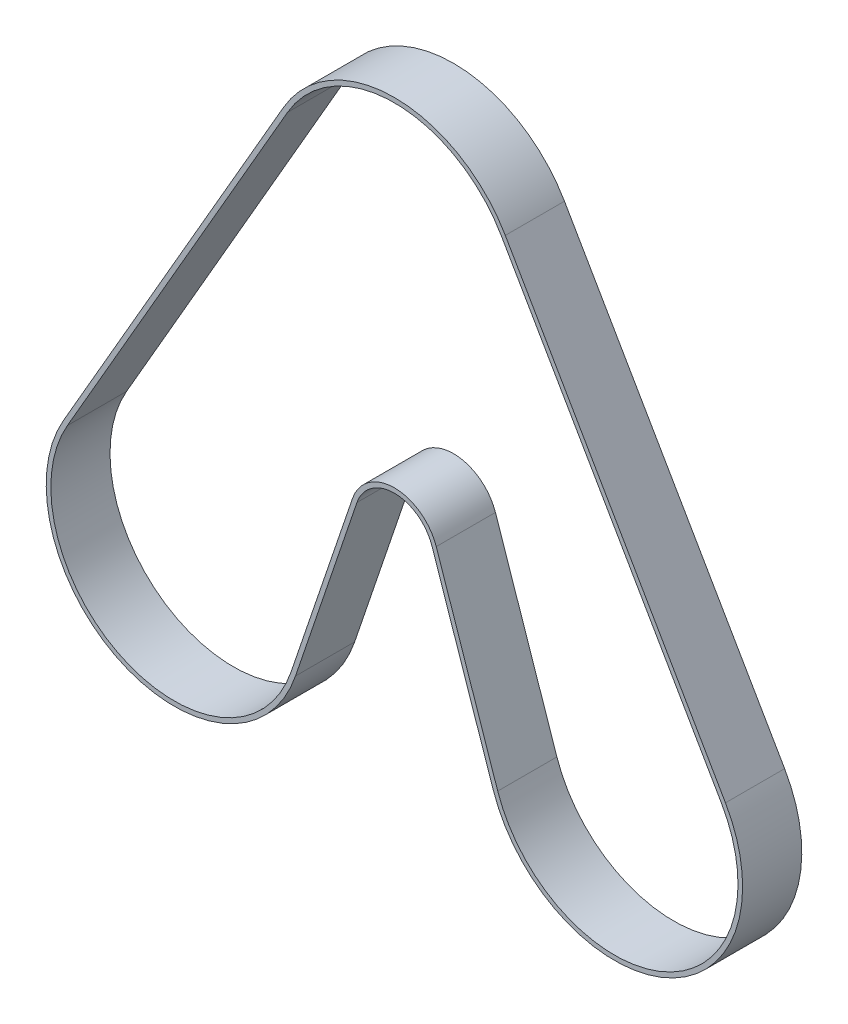
ISO-10303-21;
HEADER;
FILE_DESCRIPTION(('STEP AP214'),'2;1');
FILE_NAME('part.step','',(''),(''),'','','');
FILE_SCHEMA(('AUTOMOTIVE_DESIGN { 1 0 10303 214 1 1 1 1 }'));
ENDSEC;
DATA;
#1=APPLICATION_CONTEXT('core data for automotive mechanical design processes');
#2=APPLICATION_PROTOCOL_DEFINITION('international standard','automotive_design',2000,#1);
#3=PRODUCT_CONTEXT('',#1,'mechanical');
#4=PRODUCT('Part','Part','',(#3));
#5=PRODUCT_RELATED_PRODUCT_CATEGORY('part','',(#4));
#6=PRODUCT_DEFINITION_FORMATION('','',#4);
#7=PRODUCT_DEFINITION_CONTEXT('part definition',#1,'design');
#8=PRODUCT_DEFINITION('design','',#6,#7);
#9=PRODUCT_DEFINITION_SHAPE('','',#8);
#10=(LENGTH_UNIT() NAMED_UNIT(*) SI_UNIT(.MILLI.,.METRE.));
#11=(NAMED_UNIT(*) PLANE_ANGLE_UNIT() SI_UNIT($,.RADIAN.));
#12=(NAMED_UNIT(*) SI_UNIT($,.STERADIAN.) SOLID_ANGLE_UNIT());
#13=UNCERTAINTY_MEASURE_WITH_UNIT(LENGTH_MEASURE(1.E-05),#10,'distance_accuracy_value','');
#14=(GEOMETRIC_REPRESENTATION_CONTEXT(3) GLOBAL_UNCERTAINTY_ASSIGNED_CONTEXT((#13)) GLOBAL_UNIT_ASSIGNED_CONTEXT((#10,
#11,#12)) REPRESENTATION_CONTEXT('',''));
#15=CARTESIAN_POINT('',(0.,0.,0.));
#16=DIRECTION('',(0.,0.,1.));
#17=DIRECTION('',(1.,0.,0.));
#18=AXIS2_PLACEMENT_3D('',#15,#16,#17);
#19=CARTESIAN_POINT('',(0.,27.5,3.2));
#20=DIRECTION('',(0.,0.,-1.));
#21=DIRECTION('',(-1.,0.,0.));
#22=AXIS2_PLACEMENT_3D('',#19,#20,#21);
#23=PLANE('',#22);
#24=CARTESIAN_POINT('',(0.,27.5,3.2));
#25=DIRECTION('',(0.,0.,-1.));
#26=DIRECTION('',(-1.,0.,0.));
#27=AXIS2_PLACEMENT_3D('',#24,#25,#26);
#28=CIRCLE('',#27,13.85);
#29=CARTESIAN_POINT('',(11.9944518424145,34.425,3.2));
#30=VERTEX_POINT('',#29);
#31=CARTESIAN_POINT('',(-11.9944518424145,34.425,3.2));
#32=VERTEX_POINT('',#31);
#33=EDGE_CURVE('E267',#30,#32,#28,.F.);
#34=ORIENTED_EDGE('',*,*,#33,.T.);
#35=DIRECTION('',(-0.499999999999998,-0.86602540378444,0.));
#36=VECTOR('',#35,1.);
#37=CARTESIAN_POINT('',(-11.9944518424145,34.425,3.2));
#38=LINE('',#37,#36);
#39=CARTESIAN_POINT('',(-35.8101504464865,-6.82500000000016,3.2));
#40=VERTEX_POINT('',#39);
#41=EDGE_CURVE('E270',#32,#40,#38,.T.);
#42=ORIENTED_EDGE('',*,*,#41,.T.);
#43=CARTESIAN_POINT('',(-23.815698604072,-13.7500000000001,3.2));
#44=DIRECTION('',(0.,0.,-1.));
#45=DIRECTION('',(-1.,0.,0.));
#46=AXIS2_PLACEMENT_3D('',#43,#44,#45);
#47=CIRCLE('',#46,13.85);
#48=CARTESIAN_POINT('',(-10.7011491356005,-18.2032114523135,3.2));
#49=VERTEX_POINT('',#48);
#50=EDGE_CURVE('E273',#40,#49,#47,.F.);
#51=ORIENTED_EDGE('',*,*,#50,.T.);
#52=DIRECTION('',(0.321531512802408,0.946898878589998,0.));
#53=VECTOR('',#52,1.);
#54=CARTESIAN_POINT('',(4.31986309449331,26.0331357473567,3.2));
#55=LINE('',#54,#53);
#56=CARTESIAN_POINT('',(-4.05272720036519,1.3761548747943,3.2));
#57=VERTEX_POINT('',#56);
#58=EDGE_CURVE('E275',#49,#57,#55,.T.);
#59=ORIENTED_EDGE('',*,*,#58,.T.);
#60=CARTESIAN_POINT('',(0.,0.,3.2));
#61=DIRECTION('',(0.,0.,-1.));
#62=DIRECTION('',(-1.,0.,0.));
#63=AXIS2_PLACEMENT_3D('',#60,#61,#62);
#64=CIRCLE('',#63,4.28);
#65=CARTESIAN_POINT('',(4.05272720036519,1.37615487479431,3.2));
#66=VERTEX_POINT('',#65);
#67=EDGE_CURVE('E277',#57,#66,#64,.T.);
#68=ORIENTED_EDGE('',*,*,#67,.T.);
#69=DIRECTION('',(0.321531512802408,-0.946898878589998,0.));
#70=VECTOR('',#69,1.);
#71=CARTESIAN_POINT('',(-4.31986309449332,26.0331357473567,3.2));
#72=LINE('',#71,#70);
#73=CARTESIAN_POINT('',(10.7011491356005,-18.2032114523135,3.2));
#74=VERTEX_POINT('',#73);
#75=EDGE_CURVE('E279',#66,#74,#72,.T.);
#76=ORIENTED_EDGE('',*,*,#75,.T.);
#77=CARTESIAN_POINT('',(23.815698604072,-13.7500000000001,3.2));
#78=DIRECTION('',(0.,0.,-1.));
#79=DIRECTION('',(-1.,0.,0.));
#80=AXIS2_PLACEMENT_3D('',#77,#78,#79);
#81=CIRCLE('',#80,13.85);
#82=CARTESIAN_POINT('',(35.8101504464865,-6.82500000000014,3.2));
#83=VERTEX_POINT('',#82);
#84=EDGE_CURVE('E281',#74,#83,#81,.F.);
#85=ORIENTED_EDGE('',*,*,#84,.T.);
#86=DIRECTION('',(-0.499999999999998,0.86602540378444,0.));
#87=VECTOR('',#86,1.);
#88=CARTESIAN_POINT('',(11.9944518424145,34.425,3.2));
#89=LINE('',#88,#87);
#90=EDGE_CURVE('E283',#83,#30,#89,.T.);
#91=ORIENTED_EDGE('',*,*,#90,.T.);
#92=EDGE_LOOP('',(#34,#42,#51,#59,#68,#76,#85,#91));
#93=FACE_BOUND('',#92,.T.);
#94=CARTESIAN_POINT('',(0.,27.5,3.2));
#95=DIRECTION('',(0.,0.,-1.));
#96=DIRECTION('',(-1.,0.,0.));
#97=AXIS2_PLACEMENT_3D('',#94,#95,#96);
#98=CIRCLE('',#97,13.35);
#99=CARTESIAN_POINT('',(11.5614391405223,34.175,3.2));
#100=VERTEX_POINT('',#99);
#101=CARTESIAN_POINT('',(-11.5614391405223,34.175,3.2));
#102=VERTEX_POINT('',#101);
#103=EDGE_CURVE('E202',#100,#102,#98,.F.);
#104=ORIENTED_EDGE('',*,*,#103,.F.);
#105=DIRECTION('',(-0.499999999999998,0.86602540378444,0.));
#106=VECTOR('',#105,1.);
#107=CARTESIAN_POINT('',(11.5614391405223,34.175,3.2));
#108=LINE('',#107,#106);
#109=CARTESIAN_POINT('',(35.3771377445943,-7.07500000000014,3.2));
#110=VERTEX_POINT('',#109);
#111=EDGE_CURVE('E235',#110,#100,#108,.T.);
#112=ORIENTED_EDGE('',*,*,#111,.F.);
#113=CARTESIAN_POINT('',(23.815698604072,-13.7500000000001,3.2));
#114=DIRECTION('',(0.,0.,-1.));
#115=DIRECTION('',(-1.,0.,0.));
#116=AXIS2_PLACEMENT_3D('',#113,#114,#115);
#117=CIRCLE('',#116,13.35);
#118=CARTESIAN_POINT('',(11.1745985748955,-18.0424456959123,3.2));
#119=VERTEX_POINT('',#118);
#120=EDGE_CURVE('E233',#119,#110,#117,.F.);
#121=ORIENTED_EDGE('',*,*,#120,.F.);
#122=DIRECTION('',(0.321531512802408,-0.946898878589998,0.));
#123=VECTOR('',#122,1.);
#124=CARTESIAN_POINT('',(-3.84641365519831,26.1939015037579,3.2));
#125=LINE('',#124,#123);
#126=CARTESIAN_POINT('',(4.52617663966019,1.53692063119551,3.2));
#127=VERTEX_POINT('',#126);
#128=EDGE_CURVE('E231',#127,#119,#125,.T.);
#129=ORIENTED_EDGE('',*,*,#128,.F.);
#130=CARTESIAN_POINT('',(0.,0.,3.2));
#131=DIRECTION('',(0.,0.,-1.));
#132=DIRECTION('',(-1.,0.,0.));
#133=AXIS2_PLACEMENT_3D('',#130,#131,#132);
#134=CIRCLE('',#133,4.78);
#135=CARTESIAN_POINT('',(-4.52617663966019,1.53692063119551,3.2));
#136=VERTEX_POINT('',#135);
#137=EDGE_CURVE('E229',#136,#127,#134,.T.);
#138=ORIENTED_EDGE('',*,*,#137,.F.);
#139=DIRECTION('',(0.321531512802408,0.946898878589998,0.));
#140=VECTOR('',#139,1.);
#141=CARTESIAN_POINT('',(3.84641365519831,26.1939015037579,3.2));
#142=LINE('',#141,#140);
#143=CARTESIAN_POINT('',(-11.1745985748955,-18.0424456959123,3.2));
#144=VERTEX_POINT('',#143);
#145=EDGE_CURVE('E225',#144,#136,#142,.T.);
#146=ORIENTED_EDGE('',*,*,#145,.F.);
#147=CARTESIAN_POINT('',(-23.815698604072,-13.7500000000001,3.2));
#148=DIRECTION('',(0.,0.,-1.));
#149=DIRECTION('',(-1.,0.,0.));
#150=AXIS2_PLACEMENT_3D('',#147,#148,#149);
#151=CIRCLE('',#150,13.35);
#152=CARTESIAN_POINT('',(-35.3771377445943,-7.07500000000016,3.2));
#153=VERTEX_POINT('',#152);
#154=EDGE_CURVE('E223',#153,#144,#151,.F.);
#155=ORIENTED_EDGE('',*,*,#154,.F.);
#156=DIRECTION('',(-0.499999999999998,-0.86602540378444,0.));
#157=VECTOR('',#156,1.);
#158=CARTESIAN_POINT('',(-11.5614391405223,34.175,3.2));
#159=LINE('',#158,#157);
#160=EDGE_CURVE('E210',#102,#153,#159,.T.);
#161=ORIENTED_EDGE('',*,*,#160,.F.);
#162=EDGE_LOOP('',(#104,#112,#121,#129,#138,#146,#155,#161));
#163=FACE_BOUND('',#162,.T.);
#164=ADVANCED_FACE('F89',(#93,#163),#23,.F.);
#165=CARTESIAN_POINT('',(0.,27.5,-3.2));
#166=DIRECTION('',(0.,0.,-1.));
#167=DIRECTION('',(-1.,0.,0.));
#168=AXIS2_PLACEMENT_3D('',#165,#166,#167);
#169=PLANE('',#168);
#170=CARTESIAN_POINT('',(0.,27.5,-3.2));
#171=DIRECTION('',(0.,0.,-1.));
#172=DIRECTION('',(-1.,0.,0.));
#173=AXIS2_PLACEMENT_3D('',#170,#171,#172);
#174=CIRCLE('',#173,13.85);
#175=CARTESIAN_POINT('',(11.9944518424145,34.425,-3.2));
#176=VERTEX_POINT('',#175);
#177=CARTESIAN_POINT('',(-11.9944518424145,34.425,-3.2));
#178=VERTEX_POINT('',#177);
#179=EDGE_CURVE('E218',#176,#178,#174,.F.);
#180=ORIENTED_EDGE('',*,*,#179,.F.);
#181=DIRECTION('',(-0.499999999999998,0.86602540378444,0.));
#182=VECTOR('',#181,1.);
#183=CARTESIAN_POINT('',(11.9944518424145,34.425,-3.2));
#184=LINE('',#183,#182);
#185=CARTESIAN_POINT('',(35.8101504464865,-6.82500000000014,-3.2));
#186=VERTEX_POINT('',#185);
#187=EDGE_CURVE('E271',#186,#176,#184,.T.);
#188=ORIENTED_EDGE('',*,*,#187,.F.);
#189=CARTESIAN_POINT('',(23.815698604072,-13.7500000000001,-3.2));
#190=DIRECTION('',(0.,0.,-1.));
#191=DIRECTION('',(-1.,0.,0.));
#192=AXIS2_PLACEMENT_3D('',#189,#190,#191);
#193=CIRCLE('',#192,13.85);
#194=CARTESIAN_POINT('',(10.7011491356005,-18.2032114523135,-3.2));
#195=VERTEX_POINT('',#194);
#196=EDGE_CURVE('E298',#195,#186,#193,.F.);
#197=ORIENTED_EDGE('',*,*,#196,.F.);
#198=DIRECTION('',(0.321531512802408,-0.946898878589998,0.));
#199=VECTOR('',#198,1.);
#200=CARTESIAN_POINT('',(-4.31986309449332,26.0331357473567,-3.2));
#201=LINE('',#200,#199);
#202=CARTESIAN_POINT('',(4.05272720036519,1.37615487479431,-3.2));
#203=VERTEX_POINT('',#202);
#204=EDGE_CURVE('E296',#203,#195,#201,.T.);
#205=ORIENTED_EDGE('',*,*,#204,.F.);
#206=CARTESIAN_POINT('',(0.,0.,-3.2));
#207=DIRECTION('',(0.,0.,-1.));
#208=DIRECTION('',(-1.,0.,0.));
#209=AXIS2_PLACEMENT_3D('',#206,#207,#208);
#210=CIRCLE('',#209,4.28);
#211=CARTESIAN_POINT('',(-4.05272720036519,1.3761548747943,-3.2));
#212=VERTEX_POINT('',#211);
#213=EDGE_CURVE('E294',#212,#203,#210,.T.);
#214=ORIENTED_EDGE('',*,*,#213,.F.);
#215=DIRECTION('',(0.321531512802408,0.946898878589998,0.));
#216=VECTOR('',#215,1.);
#217=CARTESIAN_POINT('',(4.31986309449331,26.0331357473567,-3.2));
#218=LINE('',#217,#216);
#219=CARTESIAN_POINT('',(-10.7011491356005,-18.2032114523135,-3.2));
#220=VERTEX_POINT('',#219);
#221=EDGE_CURVE('E292',#220,#212,#218,.T.);
#222=ORIENTED_EDGE('',*,*,#221,.F.);
#223=CARTESIAN_POINT('',(-23.815698604072,-13.7500000000001,-3.2));
#224=DIRECTION('',(0.,0.,-1.));
#225=DIRECTION('',(-1.,0.,0.));
#226=AXIS2_PLACEMENT_3D('',#223,#224,#225);
#227=CIRCLE('',#226,13.85);
#228=CARTESIAN_POINT('',(-35.8101504464865,-6.82500000000016,-3.2));
#229=VERTEX_POINT('',#228);
#230=EDGE_CURVE('E290',#229,#220,#227,.F.);
#231=ORIENTED_EDGE('',*,*,#230,.F.);
#232=DIRECTION('',(-0.499999999999998,-0.86602540378444,0.));
#233=VECTOR('',#232,1.);
#234=CARTESIAN_POINT('',(-11.9944518424145,34.425,-3.2));
#235=LINE('',#234,#233);
#236=EDGE_CURVE('E288',#178,#229,#235,.T.);
#237=ORIENTED_EDGE('',*,*,#236,.F.);
#238=EDGE_LOOP('',(#180,#188,#197,#205,#214,#222,#231,#237));
#239=FACE_BOUND('',#238,.T.);
#240=DIRECTION('',(-0.499999999999998,0.86602540378444,0.));
#241=VECTOR('',#240,1.);
#242=CARTESIAN_POINT('',(11.5614391405223,34.175,-3.2));
#243=LINE('',#242,#241);
#244=CARTESIAN_POINT('',(35.3771377445943,-7.07500000000014,-3.2));
#245=VERTEX_POINT('',#244);
#246=CARTESIAN_POINT('',(11.5614391405223,34.175,-3.2));
#247=VERTEX_POINT('',#246);
#248=EDGE_CURVE('E211',#245,#247,#243,.T.);
#249=ORIENTED_EDGE('',*,*,#248,.T.);
#250=CARTESIAN_POINT('',(0.,27.5,-3.2));
#251=DIRECTION('',(0.,0.,-1.));
#252=DIRECTION('',(-1.,0.,0.));
#253=AXIS2_PLACEMENT_3D('',#250,#251,#252);
#254=CIRCLE('',#253,13.35);
#255=CARTESIAN_POINT('',(-11.5614391405223,34.175,-3.2));
#256=VERTEX_POINT('',#255);
#257=EDGE_CURVE('E112',#247,#256,#254,.F.);
#258=ORIENTED_EDGE('',*,*,#257,.T.);
#259=DIRECTION('',(-0.499999999999998,-0.86602540378444,0.));
#260=VECTOR('',#259,1.);
#261=CARTESIAN_POINT('',(-11.5614391405223,34.175,-3.2));
#262=LINE('',#261,#260);
#263=CARTESIAN_POINT('',(-35.3771377445943,-7.07500000000016,-3.2));
#264=VERTEX_POINT('',#263);
#265=EDGE_CURVE('E217',#256,#264,#262,.T.);
#266=ORIENTED_EDGE('',*,*,#265,.T.);
#267=CARTESIAN_POINT('',(-23.815698604072,-13.7500000000001,-3.2));
#268=DIRECTION('',(0.,0.,-1.));
#269=DIRECTION('',(-1.,0.,0.));
#270=AXIS2_PLACEMENT_3D('',#267,#268,#269);
#271=CIRCLE('',#270,13.35);
#272=CARTESIAN_POINT('',(-11.1745985748955,-18.0424456959123,-3.2));
#273=VERTEX_POINT('',#272);
#274=EDGE_CURVE('E239',#264,#273,#271,.F.);
#275=ORIENTED_EDGE('',*,*,#274,.T.);
#276=DIRECTION('',(0.321531512802408,0.946898878589998,0.));
#277=VECTOR('',#276,1.);
#278=CARTESIAN_POINT('',(3.84641365519831,26.1939015037579,-3.2));
#279=LINE('',#278,#277);
#280=CARTESIAN_POINT('',(-4.52617663966019,1.53692063119551,-3.2));
#281=VERTEX_POINT('',#280);
#282=EDGE_CURVE('E242',#273,#281,#279,.T.);
#283=ORIENTED_EDGE('',*,*,#282,.T.);
#284=CARTESIAN_POINT('',(0.,0.,-3.2));
#285=DIRECTION('',(0.,0.,-1.));
#286=DIRECTION('',(-1.,0.,0.));
#287=AXIS2_PLACEMENT_3D('',#284,#285,#286);
#288=CIRCLE('',#287,4.78);
#289=CARTESIAN_POINT('',(4.52617663966019,1.53692063119551,-3.2));
#290=VERTEX_POINT('',#289);
#291=EDGE_CURVE('E245',#281,#290,#288,.T.);
#292=ORIENTED_EDGE('',*,*,#291,.T.);
#293=DIRECTION('',(0.321531512802408,-0.946898878589998,0.));
#294=VECTOR('',#293,1.);
#295=CARTESIAN_POINT('',(-3.84641365519831,26.1939015037579,-3.2));
#296=LINE('',#295,#294);
#297=CARTESIAN_POINT('',(11.1745985748955,-18.0424456959123,-3.2));
#298=VERTEX_POINT('',#297);
#299=EDGE_CURVE('E248',#290,#298,#296,.T.);
#300=ORIENTED_EDGE('',*,*,#299,.T.);
#301=CARTESIAN_POINT('',(23.815698604072,-13.7500000000001,-3.2));
#302=DIRECTION('',(0.,0.,-1.));
#303=DIRECTION('',(-1.,0.,0.));
#304=AXIS2_PLACEMENT_3D('',#301,#302,#303);
#305=CIRCLE('',#304,13.35);
#306=EDGE_CURVE('E251',#298,#245,#305,.F.);
#307=ORIENTED_EDGE('',*,*,#306,.T.);
#308=EDGE_LOOP('',(#249,#258,#266,#275,#283,#292,#300,#307));
#309=FACE_BOUND('',#308,.T.);
#310=ADVANCED_FACE('F328',(#239,#309),#169,.T.);
#311=CARTESIAN_POINT('',(0.,27.5,3.2));
#312=DIRECTION('',(0.,0.,-1.));
#313=DIRECTION('',(-1.,0.,0.));
#314=AXIS2_PLACEMENT_3D('',#311,#312,#313);
#315=CYLINDRICAL_SURFACE('',#314,13.85);
#316=ORIENTED_EDGE('',*,*,#179,.T.);
#317=DIRECTION('',(0.,0.,-1.));
#318=VECTOR('',#317,1.);
#319=CARTESIAN_POINT('',(-11.9944518424145,34.425,3.2));
#320=LINE('',#319,#318);
#321=EDGE_CURVE('E12',#32,#178,#320,.T.);
#322=ORIENTED_EDGE('',*,*,#321,.F.);
#323=ORIENTED_EDGE('',*,*,#33,.F.);
#324=DIRECTION('',(0.,0.,-1.));
#325=VECTOR('',#324,1.);
#326=CARTESIAN_POINT('',(11.9944518424145,34.425,3.2));
#327=LINE('',#326,#325);
#328=EDGE_CURVE('E285',#30,#176,#327,.T.);
#329=ORIENTED_EDGE('',*,*,#328,.T.);
#330=EDGE_LOOP('',(#316,#322,#323,#329));
#331=FACE_BOUND('',#330,.T.);
#332=ADVANCED_FACE('F91',(#331),#315,.T.);
#333=CARTESIAN_POINT('',(-11.9944518424145,34.425,3.2));
#334=DIRECTION('',(0.86602540378444,-0.499999999999998,0.));
#335=DIRECTION('',(0.499999999999998,0.86602540378444,0.));
#336=AXIS2_PLACEMENT_3D('',#333,#334,#335);
#337=PLANE('',#336);
#338=ORIENTED_EDGE('',*,*,#236,.T.);
#339=DIRECTION('',(0.,0.,-1.));
#340=VECTOR('',#339,1.);
#341=CARTESIAN_POINT('',(-35.8101504464865,-6.82500000000016,3.2));
#342=LINE('',#341,#340);
#343=EDGE_CURVE('E97',#40,#229,#342,.T.);
#344=ORIENTED_EDGE('',*,*,#343,.F.);
#345=ORIENTED_EDGE('',*,*,#41,.F.);
#346=ORIENTED_EDGE('',*,*,#321,.T.);
#347=EDGE_LOOP('',(#338,#344,#345,#346));
#348=FACE_BOUND('',#347,.T.);
#349=ADVANCED_FACE('F345',(#348),#337,.F.);
#350=CARTESIAN_POINT('',(-23.815698604072,-13.7500000000001,3.2));
#351=DIRECTION('',(0.,0.,-1.));
#352=DIRECTION('',(-1.,0.,0.));
#353=AXIS2_PLACEMENT_3D('',#350,#351,#352);
#354=CYLINDRICAL_SURFACE('',#353,13.85);
#355=ORIENTED_EDGE('',*,*,#230,.T.);
#356=DIRECTION('',(0.,0.,-1.));
#357=VECTOR('',#356,1.);
#358=CARTESIAN_POINT('',(-10.7011491356005,-18.2032114523135,3.2));
#359=LINE('',#358,#357);
#360=EDGE_CURVE('E315',#49,#220,#359,.T.);
#361=ORIENTED_EDGE('',*,*,#360,.F.);
#362=ORIENTED_EDGE('',*,*,#50,.F.);
#363=ORIENTED_EDGE('',*,*,#343,.T.);
#364=EDGE_LOOP('',(#355,#361,#362,#363));
#365=FACE_BOUND('',#364,.T.);
#366=ADVANCED_FACE('F322',(#365),#354,.T.);
#367=CARTESIAN_POINT('',(4.31986309449331,26.0331357473567,3.2));
#368=DIRECTION('',(-0.946898878589998,0.321531512802408,0.));
#369=DIRECTION('',(-0.321531512802408,-0.946898878589998,0.));
#370=AXIS2_PLACEMENT_3D('',#367,#368,#369);
#371=PLANE('',#370);
#372=ORIENTED_EDGE('',*,*,#221,.T.);
#373=DIRECTION('',(0.,0.,-1.));
#374=VECTOR('',#373,1.);
#375=CARTESIAN_POINT('',(-4.05272720036519,1.3761548747943,3.2));
#376=LINE('',#375,#374);
#377=EDGE_CURVE('E312',#57,#212,#376,.T.);
#378=ORIENTED_EDGE('',*,*,#377,.F.);
#379=ORIENTED_EDGE('',*,*,#58,.F.);
#380=ORIENTED_EDGE('',*,*,#360,.T.);
#381=EDGE_LOOP('',(#372,#378,#379,#380));
#382=FACE_BOUND('',#381,.T.);
#383=ADVANCED_FACE('F334',(#382),#371,.F.);
#384=CARTESIAN_POINT('',(0.,0.,3.2));
#385=DIRECTION('',(0.,0.,-1.));
#386=DIRECTION('',(-1.,0.,0.));
#387=AXIS2_PLACEMENT_3D('',#384,#385,#386);
#388=CYLINDRICAL_SURFACE('',#387,4.28);
#389=ORIENTED_EDGE('',*,*,#213,.T.);
#390=DIRECTION('',(0.,0.,-1.));
#391=VECTOR('',#390,1.);
#392=CARTESIAN_POINT('',(4.05272720036519,1.37615487479431,3.2));
#393=LINE('',#392,#391);
#394=EDGE_CURVE('E309',#66,#203,#393,.T.);
#395=ORIENTED_EDGE('',*,*,#394,.F.);
#396=ORIENTED_EDGE('',*,*,#67,.F.);
#397=ORIENTED_EDGE('',*,*,#377,.T.);
#398=EDGE_LOOP('',(#389,#395,#396,#397));
#399=FACE_BOUND('',#398,.T.);
#400=ADVANCED_FACE('F338',(#399),#388,.F.);
#401=CARTESIAN_POINT('',(-4.31986309449332,26.0331357473567,3.2));
#402=DIRECTION('',(0.946898878589998,0.321531512802408,0.));
#403=DIRECTION('',(-0.321531512802408,0.946898878589998,0.));
#404=AXIS2_PLACEMENT_3D('',#401,#402,#403);
#405=PLANE('',#404);
#406=ORIENTED_EDGE('',*,*,#204,.T.);
#407=DIRECTION('',(0.,0.,-1.));
#408=VECTOR('',#407,1.);
#409=CARTESIAN_POINT('',(10.7011491356005,-18.2032114523135,3.2));
#410=LINE('',#409,#408);
#411=EDGE_CURVE('E306',#74,#195,#410,.T.);
#412=ORIENTED_EDGE('',*,*,#411,.F.);
#413=ORIENTED_EDGE('',*,*,#75,.F.);
#414=ORIENTED_EDGE('',*,*,#394,.T.);
#415=EDGE_LOOP('',(#406,#412,#413,#414));
#416=FACE_BOUND('',#415,.T.);
#417=ADVANCED_FACE('F358',(#416),#405,.F.);
#418=CARTESIAN_POINT('',(23.815698604072,-13.7500000000001,3.2));
#419=DIRECTION('',(0.,0.,-1.));
#420=DIRECTION('',(-1.,0.,0.));
#421=AXIS2_PLACEMENT_3D('',#418,#419,#420);
#422=CYLINDRICAL_SURFACE('',#421,13.85);
#423=ORIENTED_EDGE('',*,*,#196,.T.);
#424=DIRECTION('',(0.,0.,-1.));
#425=VECTOR('',#424,1.);
#426=CARTESIAN_POINT('',(35.8101504464865,-6.82500000000014,3.2));
#427=LINE('',#426,#425);
#428=EDGE_CURVE('E303',#83,#186,#427,.T.);
#429=ORIENTED_EDGE('',*,*,#428,.F.);
#430=ORIENTED_EDGE('',*,*,#84,.F.);
#431=ORIENTED_EDGE('',*,*,#411,.T.);
#432=EDGE_LOOP('',(#423,#429,#430,#431));
#433=FACE_BOUND('',#432,.T.);
#434=ADVANCED_FACE('F356',(#433),#422,.T.);
#435=CARTESIAN_POINT('',(11.9944518424145,34.425,3.2));
#436=DIRECTION('',(-0.86602540378444,-0.499999999999998,0.));
#437=DIRECTION('',(0.499999999999998,-0.86602540378444,0.));
#438=AXIS2_PLACEMENT_3D('',#435,#436,#437);
#439=PLANE('',#438);
#440=ORIENTED_EDGE('',*,*,#187,.T.);
#441=ORIENTED_EDGE('',*,*,#328,.F.);
#442=ORIENTED_EDGE('',*,*,#90,.F.);
#443=ORIENTED_EDGE('',*,*,#428,.T.);
#444=EDGE_LOOP('',(#440,#441,#442,#443));
#445=FACE_BOUND('',#444,.T.);
#446=ADVANCED_FACE('F351',(#445),#439,.F.);
#447=CARTESIAN_POINT('',(0.,27.5,3.2));
#448=DIRECTION('',(0.,0.,-1.));
#449=DIRECTION('',(-1.,0.,0.));
#450=AXIS2_PLACEMENT_3D('',#447,#448,#449);
#451=CYLINDRICAL_SURFACE('',#450,13.35);
#452=ORIENTED_EDGE('',*,*,#257,.F.);
#453=DIRECTION('',(0.,0.,-1.));
#454=VECTOR('',#453,1.);
#455=CARTESIAN_POINT('',(11.5614391405223,34.175,3.2));
#456=LINE('',#455,#454);
#457=EDGE_CURVE('E206',#100,#247,#456,.T.);
#458=ORIENTED_EDGE('',*,*,#457,.F.);
#459=ORIENTED_EDGE('',*,*,#103,.T.);
#460=DIRECTION('',(0.,0.,-1.));
#461=VECTOR('',#460,1.);
#462=CARTESIAN_POINT('',(-11.5614391405223,34.175,3.2));
#463=LINE('',#462,#461);
#464=EDGE_CURVE('E205',#102,#256,#463,.T.);
#465=ORIENTED_EDGE('',*,*,#464,.T.);
#466=EDGE_LOOP('',(#452,#458,#459,#465));
#467=FACE_BOUND('',#466,.T.);
#468=ADVANCED_FACE('F204',(#467),#451,.F.);
#469=CARTESIAN_POINT('',(-11.5614391405223,34.175,3.2));
#470=DIRECTION('',(0.86602540378444,-0.499999999999998,0.));
#471=DIRECTION('',(0.499999999999998,0.86602540378444,0.));
#472=AXIS2_PLACEMENT_3D('',#469,#470,#471);
#473=PLANE('',#472);
#474=ORIENTED_EDGE('',*,*,#265,.F.);
#475=ORIENTED_EDGE('',*,*,#464,.F.);
#476=ORIENTED_EDGE('',*,*,#160,.T.);
#477=DIRECTION('',(0.,0.,-1.));
#478=VECTOR('',#477,1.);
#479=CARTESIAN_POINT('',(-35.3771377445943,-7.07500000000016,3.2));
#480=LINE('',#479,#478);
#481=EDGE_CURVE('E219',#153,#264,#480,.T.);
#482=ORIENTED_EDGE('',*,*,#481,.T.);
#483=EDGE_LOOP('',(#474,#475,#476,#482));
#484=FACE_BOUND('',#483,.T.);
#485=ADVANCED_FACE('F214',(#484),#473,.T.);
#486=CARTESIAN_POINT('',(-23.815698604072,-13.7500000000001,3.2));
#487=DIRECTION('',(0.,0.,-1.));
#488=DIRECTION('',(-1.,0.,0.));
#489=AXIS2_PLACEMENT_3D('',#486,#487,#488);
#490=CYLINDRICAL_SURFACE('',#489,13.35);
#491=ORIENTED_EDGE('',*,*,#274,.F.);
#492=ORIENTED_EDGE('',*,*,#481,.F.);
#493=ORIENTED_EDGE('',*,*,#154,.T.);
#494=DIRECTION('',(0.,0.,-1.));
#495=VECTOR('',#494,1.);
#496=CARTESIAN_POINT('',(-11.1745985748955,-18.0424456959123,3.2));
#497=LINE('',#496,#495);
#498=EDGE_CURVE('E264',#144,#273,#497,.T.);
#499=ORIENTED_EDGE('',*,*,#498,.T.);
#500=EDGE_LOOP('',(#491,#492,#493,#499));
#501=FACE_BOUND('',#500,.T.);
#502=ADVANCED_FACE('F383',(#501),#490,.F.);
#503=CARTESIAN_POINT('',(3.84641365519831,26.1939015037579,3.2));
#504=DIRECTION('',(-0.946898878589998,0.321531512802408,0.));
#505=DIRECTION('',(-0.321531512802408,-0.946898878589998,0.));
#506=AXIS2_PLACEMENT_3D('',#503,#504,#505);
#507=PLANE('',#506);
#508=ORIENTED_EDGE('',*,*,#282,.F.);
#509=ORIENTED_EDGE('',*,*,#498,.F.);
#510=ORIENTED_EDGE('',*,*,#145,.T.);
#511=DIRECTION('',(0.,0.,-1.));
#512=VECTOR('',#511,1.);
#513=CARTESIAN_POINT('',(-4.52617663966019,1.53692063119551,3.2));
#514=LINE('',#513,#512);
#515=EDGE_CURVE('E262',#136,#281,#514,.T.);
#516=ORIENTED_EDGE('',*,*,#515,.T.);
#517=EDGE_LOOP('',(#508,#509,#510,#516));
#518=FACE_BOUND('',#517,.T.);
#519=ADVANCED_FACE('F387',(#518),#507,.T.);
#520=CARTESIAN_POINT('',(0.,0.,3.2));
#521=DIRECTION('',(0.,0.,-1.));
#522=DIRECTION('',(-1.,0.,0.));
#523=AXIS2_PLACEMENT_3D('',#520,#521,#522);
#524=CYLINDRICAL_SURFACE('',#523,4.78);
#525=ORIENTED_EDGE('',*,*,#291,.F.);
#526=ORIENTED_EDGE('',*,*,#515,.F.);
#527=ORIENTED_EDGE('',*,*,#137,.T.);
#528=DIRECTION('',(0.,0.,-1.));
#529=VECTOR('',#528,1.);
#530=CARTESIAN_POINT('',(4.52617663966019,1.53692063119551,3.2));
#531=LINE('',#530,#529);
#532=EDGE_CURVE('E260',#127,#290,#531,.T.);
#533=ORIENTED_EDGE('',*,*,#532,.T.);
#534=EDGE_LOOP('',(#525,#526,#527,#533));
#535=FACE_BOUND('',#534,.T.);
#536=ADVANCED_FACE('F393',(#535),#524,.T.);
#537=CARTESIAN_POINT('',(-3.84641365519831,26.1939015037579,3.2));
#538=DIRECTION('',(0.946898878589998,0.321531512802408,0.));
#539=DIRECTION('',(-0.321531512802408,0.946898878589998,0.));
#540=AXIS2_PLACEMENT_3D('',#537,#538,#539);
#541=PLANE('',#540);
#542=ORIENTED_EDGE('',*,*,#299,.F.);
#543=ORIENTED_EDGE('',*,*,#532,.F.);
#544=ORIENTED_EDGE('',*,*,#128,.T.);
#545=DIRECTION('',(0.,0.,-1.));
#546=VECTOR('',#545,1.);
#547=CARTESIAN_POINT('',(11.1745985748955,-18.0424456959123,3.2));
#548=LINE('',#547,#546);
#549=EDGE_CURVE('E258',#119,#298,#548,.T.);
#550=ORIENTED_EDGE('',*,*,#549,.T.);
#551=EDGE_LOOP('',(#542,#543,#544,#550));
#552=FACE_BOUND('',#551,.T.);
#553=ADVANCED_FACE('F397',(#552),#541,.T.);
#554=CARTESIAN_POINT('',(23.815698604072,-13.7500000000001,3.2));
#555=DIRECTION('',(0.,0.,-1.));
#556=DIRECTION('',(-1.,0.,0.));
#557=AXIS2_PLACEMENT_3D('',#554,#555,#556);
#558=CYLINDRICAL_SURFACE('',#557,13.35);
#559=ORIENTED_EDGE('',*,*,#306,.F.);
#560=ORIENTED_EDGE('',*,*,#549,.F.);
#561=ORIENTED_EDGE('',*,*,#120,.T.);
#562=DIRECTION('',(0.,0.,-1.));
#563=VECTOR('',#562,1.);
#564=CARTESIAN_POINT('',(35.3771377445943,-7.07500000000014,3.2));
#565=LINE('',#564,#563);
#566=EDGE_CURVE('E104',#110,#245,#565,.T.);
#567=ORIENTED_EDGE('',*,*,#566,.T.);
#568=EDGE_LOOP('',(#559,#560,#561,#567));
#569=FACE_BOUND('',#568,.T.);
#570=ADVANCED_FACE('F401',(#569),#558,.F.);
#571=CARTESIAN_POINT('',(11.5614391405223,34.175,3.2));
#572=DIRECTION('',(-0.86602540378444,-0.499999999999998,0.));
#573=DIRECTION('',(0.499999999999998,-0.86602540378444,0.));
#574=AXIS2_PLACEMENT_3D('',#571,#572,#573);
#575=PLANE('',#574);
#576=ORIENTED_EDGE('',*,*,#248,.F.);
#577=ORIENTED_EDGE('',*,*,#566,.F.);
#578=ORIENTED_EDGE('',*,*,#111,.T.);
#579=ORIENTED_EDGE('',*,*,#457,.T.);
#580=EDGE_LOOP('',(#576,#577,#578,#579));
#581=FACE_BOUND('',#580,.T.);
#582=ADVANCED_FACE('F405',(#581),#575,.T.);
#583=CLOSED_SHELL('',(#164,#310,#332,#349,#366,#383,#400,#417,#434,#446,#468,#485,#502,#519,
#536,#553,#570,#582));
#584=MANIFOLD_SOLID_BREP('B2',#583);
#585=ADVANCED_BREP_SHAPE_REPRESENTATION('',(#18,#584),#14);
#586=SHAPE_DEFINITION_REPRESENTATION(#9,#585);
ENDSEC;
END-ISO-10303-21;
